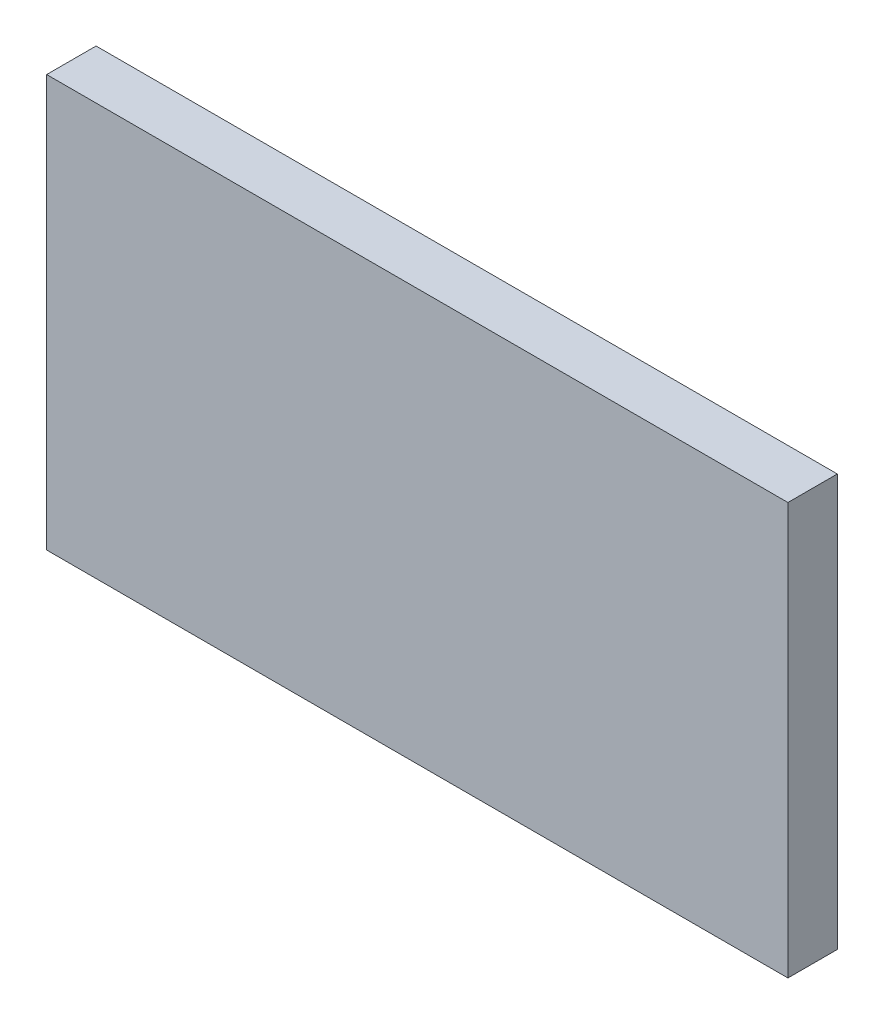
ISO-10303-21;
HEADER;
FILE_DESCRIPTION(('STEP AP214'),'2;1');
FILE_NAME('part.step','',(''),(''),'','','');
FILE_SCHEMA(('AUTOMOTIVE_DESIGN { 1 0 10303 214 1 1 1 1 }'));
ENDSEC;
DATA;
#1=APPLICATION_CONTEXT('core data for automotive mechanical design processes');
#2=APPLICATION_PROTOCOL_DEFINITION('international standard','automotive_design',2000,#1);
#3=PRODUCT_CONTEXT('',#1,'mechanical');
#4=PRODUCT('Part','Part','',(#3));
#5=PRODUCT_RELATED_PRODUCT_CATEGORY('part','',(#4));
#6=PRODUCT_DEFINITION_FORMATION('','',#4);
#7=PRODUCT_DEFINITION_CONTEXT('part definition',#1,'design');
#8=PRODUCT_DEFINITION('design','',#6,#7);
#9=PRODUCT_DEFINITION_SHAPE('','',#8);
#10=(LENGTH_UNIT() NAMED_UNIT(*) SI_UNIT(.MILLI.,.METRE.));
#11=(NAMED_UNIT(*) PLANE_ANGLE_UNIT() SI_UNIT($,.RADIAN.));
#12=(NAMED_UNIT(*) SI_UNIT($,.STERADIAN.) SOLID_ANGLE_UNIT());
#13=UNCERTAINTY_MEASURE_WITH_UNIT(LENGTH_MEASURE(1.E-05),#10,'distance_accuracy_value','');
#14=(GEOMETRIC_REPRESENTATION_CONTEXT(3) GLOBAL_UNCERTAINTY_ASSIGNED_CONTEXT((#13)) GLOBAL_UNIT_ASSIGNED_CONTEXT((#10,
#11,#12)) REPRESENTATION_CONTEXT('',''));
#15=CARTESIAN_POINT('',(0.,0.,0.));
#16=DIRECTION('',(0.,0.,1.));
#17=DIRECTION('',(1.,0.,0.));
#18=AXIS2_PLACEMENT_3D('',#15,#16,#17);
#19=CARTESIAN_POINT('',(-21.0263654878726,12.9293087014065,3.));
#20=DIRECTION('',(1.,0.,0.));
#21=DIRECTION('',(0.,1.,0.));
#22=AXIS2_PLACEMENT_3D('',#19,#20,#21);
#23=PLANE('',#22);
#24=DIRECTION('',(0.,-1.,0.));
#25=VECTOR('',#24,1.);
#26=CARTESIAN_POINT('',(-21.0263654878726,12.9293087014065,0.));
#27=LINE('',#26,#25);
#28=CARTESIAN_POINT('',(-21.0263654878726,12.9293087014065,0.));
#29=VERTEX_POINT('',#28);
#30=CARTESIAN_POINT('',(-21.0263654878726,-12.0706912985935,0.));
#31=VERTEX_POINT('',#30);
#32=EDGE_CURVE('E113',#29,#31,#27,.T.);
#33=ORIENTED_EDGE('',*,*,#32,.T.);
#34=DIRECTION('',(0.,0.,-1.));
#35=VECTOR('',#34,1.);
#36=CARTESIAN_POINT('',(-21.0263654878726,-12.0706912985935,3.));
#37=LINE('',#36,#35);
#38=CARTESIAN_POINT('',(-21.0263654878726,-12.0706912985935,3.));
#39=VERTEX_POINT('',#38);
#40=EDGE_CURVE('E11',#39,#31,#37,.T.);
#41=ORIENTED_EDGE('',*,*,#40,.F.);
#42=DIRECTION('',(0.,-1.,0.));
#43=VECTOR('',#42,1.);
#44=CARTESIAN_POINT('',(-21.0263654878726,12.9293087014065,3.));
#45=LINE('',#44,#43);
#46=CARTESIAN_POINT('',(-21.0263654878726,12.9293087014065,3.));
#47=VERTEX_POINT('',#46);
#48=EDGE_CURVE('E97',#47,#39,#45,.T.);
#49=ORIENTED_EDGE('',*,*,#48,.F.);
#50=DIRECTION('',(0.,0.,-1.));
#51=VECTOR('',#50,1.);
#52=CARTESIAN_POINT('',(-21.0263654878726,12.9293087014065,3.));
#53=LINE('',#52,#51);
#54=EDGE_CURVE('E109',#47,#29,#53,.T.);
#55=ORIENTED_EDGE('',*,*,#54,.T.);
#56=EDGE_LOOP('',(#33,#41,#49,#55));
#57=FACE_BOUND('',#56,.T.);
#58=ADVANCED_FACE('F45',(#57),#23,.F.);
#59=CARTESIAN_POINT('',(-21.0263654878726,-12.0706912985935,3.));
#60=DIRECTION('',(0.,1.,0.));
#61=DIRECTION('',(0.,0.,1.));
#62=AXIS2_PLACEMENT_3D('',#59,#60,#61);
#63=PLANE('',#62);
#64=DIRECTION('',(1.,0.,0.));
#65=VECTOR('',#64,1.);
#66=CARTESIAN_POINT('',(-21.0263654878726,-12.0706912985935,0.));
#67=LINE('',#66,#65);
#68=CARTESIAN_POINT('',(23.9736345121274,-12.0706912985935,0.));
#69=VERTEX_POINT('',#68);
#70=EDGE_CURVE('E102',#31,#69,#67,.T.);
#71=ORIENTED_EDGE('',*,*,#70,.T.);
#72=DIRECTION('',(0.,0.,-1.));
#73=VECTOR('',#72,1.);
#74=CARTESIAN_POINT('',(23.9736345121274,-12.0706912985935,3.));
#75=LINE('',#74,#73);
#76=CARTESIAN_POINT('',(23.9736345121274,-12.0706912985935,3.));
#77=VERTEX_POINT('',#76);
#78=EDGE_CURVE('E54',#77,#69,#75,.T.);
#79=ORIENTED_EDGE('',*,*,#78,.F.);
#80=DIRECTION('',(1.,0.,0.));
#81=VECTOR('',#80,1.);
#82=CARTESIAN_POINT('',(-21.0263654878726,-12.0706912985935,3.));
#83=LINE('',#82,#81);
#84=EDGE_CURVE('E92',#39,#77,#83,.T.);
#85=ORIENTED_EDGE('',*,*,#84,.F.);
#86=ORIENTED_EDGE('',*,*,#40,.T.);
#87=EDGE_LOOP('',(#71,#79,#85,#86));
#88=FACE_BOUND('',#87,.T.);
#89=ADVANCED_FACE('F101',(#88),#63,.F.);
#90=CARTESIAN_POINT('',(23.9736345121274,12.9293087014065,3.));
#91=DIRECTION('',(-1.,0.,0.));
#92=DIRECTION('',(0.,-1.,0.));
#93=AXIS2_PLACEMENT_3D('',#90,#91,#92);
#94=PLANE('',#93);
#95=DIRECTION('',(0.,1.,0.));
#96=VECTOR('',#95,1.);
#97=CARTESIAN_POINT('',(23.9736345121274,12.9293087014065,0.));
#98=LINE('',#97,#96);
#99=CARTESIAN_POINT('',(23.9736345121274,12.9293087014065,0.));
#100=VERTEX_POINT('',#99);
#101=EDGE_CURVE('E79',#69,#100,#98,.T.);
#102=ORIENTED_EDGE('',*,*,#101,.T.);
#103=DIRECTION('',(0.,0.,-1.));
#104=VECTOR('',#103,1.);
#105=CARTESIAN_POINT('',(23.9736345121274,12.9293087014065,3.));
#106=LINE('',#105,#104);
#107=CARTESIAN_POINT('',(23.9736345121274,12.9293087014065,3.));
#108=VERTEX_POINT('',#107);
#109=EDGE_CURVE('E104',#108,#100,#106,.T.);
#110=ORIENTED_EDGE('',*,*,#109,.F.);
#111=DIRECTION('',(0.,1.,0.));
#112=VECTOR('',#111,1.);
#113=CARTESIAN_POINT('',(23.9736345121274,12.9293087014065,3.));
#114=LINE('',#113,#112);
#115=EDGE_CURVE('E95',#77,#108,#114,.T.);
#116=ORIENTED_EDGE('',*,*,#115,.F.);
#117=ORIENTED_EDGE('',*,*,#78,.T.);
#118=EDGE_LOOP('',(#102,#110,#116,#117));
#119=FACE_BOUND('',#118,.T.);
#120=ADVANCED_FACE('F105',(#119),#94,.F.);
#121=CARTESIAN_POINT('',(-21.0263654878726,12.9293087014065,3.));
#122=DIRECTION('',(0.,-1.,0.));
#123=DIRECTION('',(0.,0.,-1.));
#124=AXIS2_PLACEMENT_3D('',#121,#122,#123);
#125=PLANE('',#124);
#126=DIRECTION('',(-1.,0.,0.));
#127=VECTOR('',#126,1.);
#128=CARTESIAN_POINT('',(-21.0263654878726,12.9293087014065,0.));
#129=LINE('',#128,#127);
#130=EDGE_CURVE('E85',#100,#29,#129,.T.);
#131=ORIENTED_EDGE('',*,*,#130,.T.);
#132=ORIENTED_EDGE('',*,*,#54,.F.);
#133=DIRECTION('',(-1.,0.,0.));
#134=VECTOR('',#133,1.);
#135=CARTESIAN_POINT('',(-21.0263654878726,12.9293087014065,3.));
#136=LINE('',#135,#134);
#137=EDGE_CURVE('E62',#108,#47,#136,.T.);
#138=ORIENTED_EDGE('',*,*,#137,.F.);
#139=ORIENTED_EDGE('',*,*,#109,.T.);
#140=EDGE_LOOP('',(#131,#132,#138,#139));
#141=FACE_BOUND('',#140,.T.);
#142=ADVANCED_FACE('F126',(#141),#125,.F.);
#143=CARTESIAN_POINT('',(0.,0.,3.));
#144=DIRECTION('',(0.,0.,1.));
#145=DIRECTION('',(1.,0.,0.));
#146=AXIS2_PLACEMENT_3D('',#143,#144,#145);
#147=PLANE('',#146);
#148=ORIENTED_EDGE('',*,*,#48,.T.);
#149=ORIENTED_EDGE('',*,*,#84,.T.);
#150=ORIENTED_EDGE('',*,*,#115,.T.);
#151=ORIENTED_EDGE('',*,*,#137,.T.);
#152=EDGE_LOOP('',(#148,#149,#150,#151));
#153=FACE_BOUND('',#152,.T.);
#154=ADVANCED_FACE('F93',(#153),#147,.T.);
#155=CARTESIAN_POINT('',(0.,0.,0.));
#156=DIRECTION('',(0.,0.,1.));
#157=DIRECTION('',(1.,0.,0.));
#158=AXIS2_PLACEMENT_3D('',#155,#156,#157);
#159=PLANE('',#158);
#160=ORIENTED_EDGE('',*,*,#32,.F.);
#161=ORIENTED_EDGE('',*,*,#130,.F.);
#162=ORIENTED_EDGE('',*,*,#101,.F.);
#163=ORIENTED_EDGE('',*,*,#70,.F.);
#164=EDGE_LOOP('',(#160,#161,#162,#163));
#165=FACE_BOUND('',#164,.T.);
#166=ADVANCED_FACE('F129',(#165),#159,.F.);
#167=CLOSED_SHELL('',(#58,#89,#120,#142,#154,#166));
#168=MANIFOLD_SOLID_BREP('B2',#167);
#169=ADVANCED_BREP_SHAPE_REPRESENTATION('',(#18,#168),#14);
#170=SHAPE_DEFINITION_REPRESENTATION(#9,#169);
ENDSEC;
END-ISO-10303-21;
